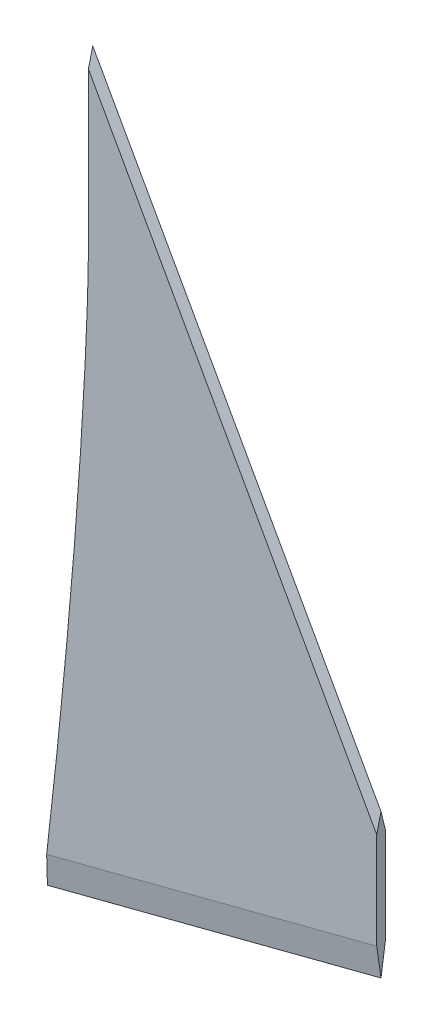
ISO-10303-21;
HEADER;
FILE_DESCRIPTION(('STEP AP214'),'2;1');
FILE_NAME('part.step','',(''),(''),'','','');
FILE_SCHEMA(('AUTOMOTIVE_DESIGN { 1 0 10303 214 1 1 1 1 }'));
ENDSEC;
DATA;
#1=APPLICATION_CONTEXT('core data for automotive mechanical design processes');
#2=APPLICATION_PROTOCOL_DEFINITION('international standard','automotive_design',2000,#1);
#3=PRODUCT_CONTEXT('',#1,'mechanical');
#4=PRODUCT('Part','Part','',(#3));
#5=PRODUCT_RELATED_PRODUCT_CATEGORY('part','',(#4));
#6=PRODUCT_DEFINITION_FORMATION('','',#4);
#7=PRODUCT_DEFINITION_CONTEXT('part definition',#1,'design');
#8=PRODUCT_DEFINITION('design','',#6,#7);
#9=PRODUCT_DEFINITION_SHAPE('','',#8);
#10=(LENGTH_UNIT() NAMED_UNIT(*) SI_UNIT(.MILLI.,.METRE.));
#11=(NAMED_UNIT(*) PLANE_ANGLE_UNIT() SI_UNIT($,.RADIAN.));
#12=(NAMED_UNIT(*) SI_UNIT($,.STERADIAN.) SOLID_ANGLE_UNIT());
#13=UNCERTAINTY_MEASURE_WITH_UNIT(LENGTH_MEASURE(1.E-05),#10,'distance_accuracy_value','');
#14=(GEOMETRIC_REPRESENTATION_CONTEXT(3) GLOBAL_UNCERTAINTY_ASSIGNED_CONTEXT((#13)) GLOBAL_UNIT_ASSIGNED_CONTEXT((#10,
#11,#12)) REPRESENTATION_CONTEXT('',''));
#15=CARTESIAN_POINT('',(0.,0.,0.));
#16=DIRECTION('',(0.,0.,1.));
#17=DIRECTION('',(1.,0.,0.));
#18=AXIS2_PLACEMENT_3D('',#15,#16,#17);
#19=CARTESIAN_POINT('',(176.000000000028,0.,3.));
#20=DIRECTION('',(1.,0.,0.));
#21=DIRECTION('',(0.,0.,-1.));
#22=AXIS2_PLACEMENT_3D('',#19,#20,#21);
#23=PLANE('',#22);
#24=DIRECTION('',(0.,0.9896222064777,0.143693731408888));
#25=VECTOR('',#24,1.);
#26=CARTESIAN_POINT('',(176.000000000028,7.04754906013995,-45.5366409708541));
#27=LINE('',#26,#25);
#28=CARTESIAN_POINT('',(176.000000000028,341.320570309148,3.));
#29=VERTEX_POINT('',#28);
#30=CARTESIAN_POINT('',(176.000000000028,330.990034,1.5));
#31=VERTEX_POINT('',#30);
#32=EDGE_CURVE('E202',#29,#31,#27,.F.);
#33=ORIENTED_EDGE('',*,*,#32,.T.);
#34=DIRECTION('',(0.,0.989622206477699,-0.143693731408889));
#35=VECTOR('',#34,1.);
#36=CARTESIAN_POINT('',(176.000000000028,6.62094153753839,48.598584636193));
#37=LINE('',#36,#35);
#38=CARTESIAN_POINT('',(176.000000000028,341.320570309148,0.));
#39=VERTEX_POINT('',#38);
#40=EDGE_CURVE('E11',#31,#39,#37,.T.);
#41=ORIENTED_EDGE('',*,*,#40,.T.);
#42=DIRECTION('',(0.,-1.,0.));
#43=VECTOR('',#42,1.);
#44=CARTESIAN_POINT('',(176.000000000028,0.,0.));
#45=LINE('',#44,#43);
#46=CARTESIAN_POINT('',(176.000000000028,374.812655915408,0.));
#47=VERTEX_POINT('',#46);
#48=EDGE_CURVE('E127',#47,#39,#45,.T.);
#49=ORIENTED_EDGE('',*,*,#48,.F.);
#50=DIRECTION('',(0.,0.97176165426244,0.23596458909151));
#51=VECTOR('',#50,1.);
#52=CARTESIAN_POINT('',(176.000000000028,21.5572055726398,-85.778006179647));
#53=LINE('',#52,#51);
#54=CARTESIAN_POINT('',(176.000000000028,380.990034,1.50000000000003));
#55=VERTEX_POINT('',#54);
#56=EDGE_CURVE('E219',#47,#55,#53,.T.);
#57=ORIENTED_EDGE('',*,*,#56,.T.);
#58=DIRECTION('',(0.,0.971761654262441,-0.235964589091507));
#59=VECTOR('',#58,1.);
#60=CARTESIAN_POINT('',(176.000000000028,20.8693015543104,88.9450440415612));
#61=LINE('',#60,#59);
#62=CARTESIAN_POINT('',(176.000000000028,374.812655915408,3.));
#63=VERTEX_POINT('',#62);
#64=EDGE_CURVE('E227',#55,#63,#61,.F.);
#65=ORIENTED_EDGE('',*,*,#64,.T.);
#66=DIRECTION('',(0.,-1.,0.));
#67=VECTOR('',#66,1.);
#68=CARTESIAN_POINT('',(176.000000000028,0.,3.));
#69=LINE('',#68,#67);
#70=EDGE_CURVE('E130',#63,#29,#69,.T.);
#71=ORIENTED_EDGE('',*,*,#70,.T.);
#72=EDGE_LOOP('',(#33,#41,#49,#57,#65,#71));
#73=FACE_BOUND('',#72,.T.);
#74=ADVANCED_FACE('F45',(#73),#23,.T.);
#75=CARTESIAN_POINT('',(0.,0.,3.));
#76=DIRECTION('',(0.,0.,1.));
#77=DIRECTION('',(1.,0.,0.));
#78=AXIS2_PLACEMENT_3D('',#75,#76,#77);
#79=PLANE('',#78);
#80=CARTESIAN_POINT('',(60.2536508811545,300.990034,3.));
#81=CARTESIAN_POINT('',(60.6785853909016,304.546365833908,3.));
#82=CARTESIAN_POINT('',(61.097200199767,308.103453170029,3.));
#83=CARTESIAN_POINT('',(61.9216842096842,315.219092907531,3.));
#84=CARTESIAN_POINT('',(62.3275534520864,318.777645304121,3.));
#85=CARTESIAN_POINT('',(63.126441409352,325.896179180605,3.));
#86=CARTESIAN_POINT('',(63.5194601715832,329.456160655181,3.));
#87=CARTESIAN_POINT('',(64.2924775573231,336.577523682173,3.));
#88=CARTESIAN_POINT('',(64.6724762295165,340.138905229302,3.));
#89=CARTESIAN_POINT('',(65.4192321078945,347.263045156729,3.));
#90=CARTESIAN_POINT('',(65.7859893561779,350.825803532611,3.));
#91=CARTESIAN_POINT('',(66.5057771569488,357.950626326355,3.));
#92=CARTESIAN_POINT('',(66.8588155224284,361.512689954679,3.));
#93=CARTESIAN_POINT('',(67.5510406758639,368.638167495362,3.));
#94=CARTESIAN_POINT('',(67.8902274478424,372.201581409272,3.));
#95=CARTESIAN_POINT('',(68.554320678043,379.329756261965,3.));
#96=CARTESIAN_POINT('',(68.8792270730575,382.894517206639,3.));
#97=CARTESIAN_POINT('',(69.5142377857487,390.02539101263,3.));
#98=CARTESIAN_POINT('',(69.8243419665478,393.59150388614,3.));
#99=CARTESIAN_POINT('',(70.4291109094859,400.725098551218,3.));
#100=CARTESIAN_POINT('',(70.7237754219409,404.292580363983,3.));
#101=CARTESIAN_POINT('',(71.215481700211,410.415426380997,3.));
#102=CARTESIAN_POINT('',(71.4164804986665,412.970473302637,3.));
#103=CARTESIAN_POINT('',(71.8098063595635,418.08123972475,3.));
#104=CARTESIAN_POINT('',(72.0021334071619,420.636959226367,3.));
#105=CARTESIAN_POINT('',(72.3777020518628,425.749044715823,3.));
#106=CARTESIAN_POINT('',(72.5609437246708,428.305410698097,3.));
#107=CARTESIAN_POINT('',(72.9178555944184,433.418768760179,3.));
#108=CARTESIAN_POINT('',(73.0915259503482,435.975760828877,3.));
#109=CARTESIAN_POINT('',(73.4287071042614,441.090357672655,3.));
#110=CARTESIAN_POINT('',(73.5922181310891,443.647962432631,3.));
#111=CARTESIAN_POINT('',(73.9083619767468,448.763780813504,3.));
#112=CARTESIAN_POINT('',(74.0609950693902,451.321994417449,3.));
#113=CARTESIAN_POINT('',(74.3545568865105,456.440425452943,3.));
#114=CARTESIAN_POINT('',(74.4954794989105,459.000643235594,3.));
#115=CARTESIAN_POINT('',(74.764355099159,464.121760164454,3.));
#116=CARTESIAN_POINT('',(74.8923081060695,466.682659309657,3.));
#117=CARTESIAN_POINT('',(75.0733052048482,470.524535886168,3.));
#118=CARTESIAN_POINT('',(75.1318158217772,471.805257098221,3.));
#119=CARTESIAN_POINT('',(75.2449049969214,474.366872517927,3.));
#120=CARTESIAN_POINT('',(75.2994835587771,475.647766725418,3.));
#121=CARTESIAN_POINT('',(75.4043978519613,478.209771726704,3.));
#122=CARTESIAN_POINT('',(75.4547334427399,479.490882526265,3.));
#123=CARTESIAN_POINT('',(75.5507300765249,482.053283654922,3.));
#124=CARTESIAN_POINT('',(75.5963911052226,483.334573984555,3.));
#125=CARTESIAN_POINT('',(75.6824404293228,485.89744400944,3.));
#126=CARTESIAN_POINT('',(75.7228282690779,487.179023720124,3.));
#127=CARTESIAN_POINT('',(75.7788864303194,489.101519519176,3.));
#128=CARTESIAN_POINT('',(75.7968184914386,489.742370054917,3.));
#129=CARTESIAN_POINT('',(75.8309962747408,491.024117345248,3.));
#130=CARTESIAN_POINT('',(75.8472419943407,491.665014099908,3.));
#131=CARTESIAN_POINT('',(75.8778032191007,492.947006803599,3.));
#132=CARTESIAN_POINT('',(75.8921182632536,493.588102763698,3.));
#133=CARTESIAN_POINT('',(75.912016986142,494.549777970235,3.));
#134=CARTESIAN_POINT('',(75.9183875775191,494.870341065097,3.));
#135=CARTESIAN_POINT('',(75.930548710234,495.511478179019,3.));
#136=CARTESIAN_POINT('',(75.9363392518424,495.832052198074,3.));
#137=CARTESIAN_POINT('',(75.947232360656,496.473220100962,3.));
#138=CARTESIAN_POINT('',(75.9523349105499,496.793813985092,3.));
#139=CARTESIAN_POINT('',(75.9616711228757,497.435014752307,3.));
#140=CARTESIAN_POINT('',(75.9659047847442,497.755621635401,3.));
#141=CARTESIAN_POINT('',(75.9715882136242,498.236541851229,3.));
#142=CARTESIAN_POINT('',(75.9733715222307,498.396851303639,3.));
#143=CARTESIAN_POINT('',(75.9767560957958,498.717471759484,3.));
#144=CARTESIAN_POINT('',(75.9783573610857,498.877782762915,3.));
#145=CARTESIAN_POINT('',(75.9812806961037,499.198408681418,3.));
#146=CARTESIAN_POINT('',(75.9826027642224,499.358723596507,3.));
#147=CARTESIAN_POINT('',(75.9845382266817,499.679358185167,3.));
#148=CARTESIAN_POINT('',(75.9851516174988,499.839677858758,3.));
#149=CARTESIAN_POINT('',(75.9851959266031,499.999999999996,3.));
#150=B_SPLINE_CURVE_WITH_KNOTS('',3,(#80,#81,#82,#83,#84,#85,#86,#87,#88,#89,#90,#91,#92,#93,
#94,#95,#96,#97,#98,#99,#100,#101,#102,#103,#104,#105,#106,#107,#108,#109,#110,#111,#112,#113,
#114,#115,#116,#117,#118,#119,#120,#121,#122,#123,#124,#125,#126,#127,#128,#129,#130,#131,#132,
#133,#134,#135,#136,#137,#138,#139,#140,#141,#142,#143,#144,#145,#146,#147,#148,#149),
.UNSPECIFIED.,.F.,.F.,(4,2,2,2,2,2,2,2,2,2,2,2,2,2,2,2,2,2,2,2,2,2,2,2,2,2,2,2,2,2,2,2,2,2,4),
(0.,10.7448815413634,21.4897282195317,32.2345352869447,42.9793021730775,53.7240348951753,
64.4625559585472,75.2010894082208,85.9396703838167,96.6783506409877,107.417204506211,
115.106013493709,122.794835641374,130.483593709711,138.172224020668,145.860681078241,
153.54894453785,161.241195870735,168.93343589784,172.779602210909,176.625764962905,
180.472055070349,184.31835695087,188.164990964161,190.088293349905,192.011598681759,
193.935362450863,194.89724122467,195.859119549879,196.821022073666,197.78292522119,
198.263883186809,198.744840277482,199.225800140543,199.706762394857),.UNSPECIFIED.);
#151=CARTESIAN_POINT('',(61.5070524907201,311.640649331816,3.));
#152=VERTEX_POINT('',#151);
#153=CARTESIAN_POINT('',(75.9851959266031,499.999999999996,3.));
#154=VERTEX_POINT('',#153);
#155=EDGE_CURVE('E106',#152,#154,#150,.T.);
#156=ORIENTED_EDGE('',*,*,#155,.F.);
#157=DIRECTION('',(0.968003954561823,0.250934939680932,0.));
#158=VECTOR('',#157,1.);
#159=CARTESIAN_POINT('',(-71.8263906768795,277.076720784791,3.));
#160=LINE('',#159,#158);
#161=EDGE_CURVE('E173',#152,#29,#160,.T.);
#162=ORIENTED_EDGE('',*,*,#161,.T.);
#163=ORIENTED_EDGE('',*,*,#70,.F.);
#164=DIRECTION('',(-0.485642931178632,0.874157276121538,0.));
#165=VECTOR('',#164,1.);
#166=CARTESIAN_POINT('',(293.609146379204,163.116192432891,3.));
#167=LINE('',#166,#165);
#168=CARTESIAN_POINT('',(75.9851959266031,554.839303247573,3.));
#169=VERTEX_POINT('',#168);
#170=EDGE_CURVE('E126',#63,#169,#167,.T.);
#171=ORIENTED_EDGE('',*,*,#170,.T.);
#172=DIRECTION('',(0.,-1.,0.));
#173=VECTOR('',#172,1.);
#174=CARTESIAN_POINT('',(75.9851959266031,0.,3.));
#175=LINE('',#174,#173);
#176=EDGE_CURVE('E114',#154,#169,#175,.F.);
#177=ORIENTED_EDGE('',*,*,#176,.F.);
#178=EDGE_LOOP('',(#156,#162,#163,#171,#177));
#179=FACE_BOUND('',#178,.T.);
#180=ADVANCED_FACE('F123',(#179),#79,.T.);
#181=CARTESIAN_POINT('',(0.,0.,0.));
#182=DIRECTION('',(0.,0.,1.));
#183=DIRECTION('',(1.,0.,0.));
#184=AXIS2_PLACEMENT_3D('',#181,#182,#183);
#185=PLANE('',#184);
#186=ORIENTED_EDGE('',*,*,#48,.T.);
#187=DIRECTION('',(-0.968003954561823,-0.250934939680932,0.));
#188=VECTOR('',#187,1.);
#189=CARTESIAN_POINT('',(57.7629696601844,310.670073545619,0.));
#190=LINE('',#189,#188);
#191=CARTESIAN_POINT('',(61.50705249072,311.640649331815,0.));
#192=VERTEX_POINT('',#191);
#193=EDGE_CURVE('E205',#39,#192,#190,.T.);
#194=ORIENTED_EDGE('',*,*,#193,.T.);
#195=CARTESIAN_POINT('',(60.2536508811545,300.990034,0.));
#196=CARTESIAN_POINT('',(60.6785853909016,304.546365833908,0.));
#197=CARTESIAN_POINT('',(61.097200199767,308.103453170029,0.));
#198=CARTESIAN_POINT('',(61.9216842096842,315.219092907531,0.));
#199=CARTESIAN_POINT('',(62.3275534520864,318.777645304121,0.));
#200=CARTESIAN_POINT('',(63.126441409352,325.896179180605,0.));
#201=CARTESIAN_POINT('',(63.5194601715832,329.456160655181,0.));
#202=CARTESIAN_POINT('',(64.2924775573231,336.577523682173,0.));
#203=CARTESIAN_POINT('',(64.6724762295165,340.138905229302,0.));
#204=CARTESIAN_POINT('',(65.4192321078945,347.263045156729,0.));
#205=CARTESIAN_POINT('',(65.7859893561779,350.825803532611,0.));
#206=CARTESIAN_POINT('',(66.5057771569488,357.950626326355,0.));
#207=CARTESIAN_POINT('',(66.8588155224284,361.512689954679,0.));
#208=CARTESIAN_POINT('',(67.5510406758639,368.638167495362,0.));
#209=CARTESIAN_POINT('',(67.8902274478424,372.201581409272,0.));
#210=CARTESIAN_POINT('',(68.554320678043,379.329756261965,0.));
#211=CARTESIAN_POINT('',(68.8792270730575,382.894517206639,0.));
#212=CARTESIAN_POINT('',(69.5142377857487,390.02539101263,0.));
#213=CARTESIAN_POINT('',(69.8243419665478,393.59150388614,0.));
#214=CARTESIAN_POINT('',(70.4291109094859,400.725098551218,0.));
#215=CARTESIAN_POINT('',(70.7237754219409,404.292580363983,0.));
#216=CARTESIAN_POINT('',(71.215481700211,410.415426380997,0.));
#217=CARTESIAN_POINT('',(71.4164804986665,412.970473302637,0.));
#218=CARTESIAN_POINT('',(71.8098063595635,418.08123972475,0.));
#219=CARTESIAN_POINT('',(72.0021334071619,420.636959226367,0.));
#220=CARTESIAN_POINT('',(72.3777020518628,425.749044715823,0.));
#221=CARTESIAN_POINT('',(72.5609437246708,428.305410698097,0.));
#222=CARTESIAN_POINT('',(72.9178555944184,433.418768760179,0.));
#223=CARTESIAN_POINT('',(73.0915259503482,435.975760828877,0.));
#224=CARTESIAN_POINT('',(73.4287071042614,441.090357672655,0.));
#225=CARTESIAN_POINT('',(73.5922181310891,443.647962432631,0.));
#226=CARTESIAN_POINT('',(73.9083619767468,448.763780813504,0.));
#227=CARTESIAN_POINT('',(74.0609950693902,451.321994417449,0.));
#228=CARTESIAN_POINT('',(74.3545568865105,456.440425452943,0.));
#229=CARTESIAN_POINT('',(74.4954794989105,459.000643235594,0.));
#230=CARTESIAN_POINT('',(74.764355099159,464.121760164454,0.));
#231=CARTESIAN_POINT('',(74.8923081060695,466.682659309657,0.));
#232=CARTESIAN_POINT('',(75.0733052048482,470.524535886168,0.));
#233=CARTESIAN_POINT('',(75.1318158217772,471.805257098221,0.));
#234=CARTESIAN_POINT('',(75.2449049969214,474.366872517927,0.));
#235=CARTESIAN_POINT('',(75.2994835587771,475.647766725418,0.));
#236=CARTESIAN_POINT('',(75.4043978519613,478.209771726704,0.));
#237=CARTESIAN_POINT('',(75.4547334427399,479.490882526265,0.));
#238=CARTESIAN_POINT('',(75.5507300765249,482.053283654922,0.));
#239=CARTESIAN_POINT('',(75.5963911052226,483.334573984555,0.));
#240=CARTESIAN_POINT('',(75.6824404293228,485.89744400944,0.));
#241=CARTESIAN_POINT('',(75.7228282690779,487.179023720124,0.));
#242=CARTESIAN_POINT('',(75.7788864303194,489.101519519176,0.));
#243=CARTESIAN_POINT('',(75.7968184914386,489.742370054917,0.));
#244=CARTESIAN_POINT('',(75.8309962747408,491.024117345248,0.));
#245=CARTESIAN_POINT('',(75.8472419943407,491.665014099908,0.));
#246=CARTESIAN_POINT('',(75.8778032191007,492.947006803599,0.));
#247=CARTESIAN_POINT('',(75.8921182632536,493.588102763698,0.));
#248=CARTESIAN_POINT('',(75.912016986142,494.549777970235,0.));
#249=CARTESIAN_POINT('',(75.9183875775191,494.870341065097,0.));
#250=CARTESIAN_POINT('',(75.930548710234,495.511478179019,0.));
#251=CARTESIAN_POINT('',(75.9363392518424,495.832052198074,0.));
#252=CARTESIAN_POINT('',(75.947232360656,496.473220100962,0.));
#253=CARTESIAN_POINT('',(75.9523349105499,496.793813985092,0.));
#254=CARTESIAN_POINT('',(75.9616711228757,497.435014752307,0.));
#255=CARTESIAN_POINT('',(75.9659047847442,497.755621635401,0.));
#256=CARTESIAN_POINT('',(75.9715882136242,498.236541851229,0.));
#257=CARTESIAN_POINT('',(75.9733715222307,498.396851303639,0.));
#258=CARTESIAN_POINT('',(75.9767560957958,498.717471759484,0.));
#259=CARTESIAN_POINT('',(75.9783573610857,498.877782762915,0.));
#260=CARTESIAN_POINT('',(75.9812806961037,499.198408681418,0.));
#261=CARTESIAN_POINT('',(75.9826027642224,499.358723596507,0.));
#262=CARTESIAN_POINT('',(75.9845382266817,499.679358185167,0.));
#263=CARTESIAN_POINT('',(75.9851516174988,499.839677858758,0.));
#264=CARTESIAN_POINT('',(75.9851959266031,499.999999999996,0.));
#265=B_SPLINE_CURVE_WITH_KNOTS('',3,(#195,#196,#197,#198,#199,#200,#201,#202,#203,#204,#205,
#206,#207,#208,#209,#210,#211,#212,#213,#214,#215,#216,#217,#218,#219,#220,#221,#222,#223,#224,
#225,#226,#227,#228,#229,#230,#231,#232,#233,#234,#235,#236,#237,#238,#239,#240,#241,#242,#243,
#244,#245,#246,#247,#248,#249,#250,#251,#252,#253,#254,#255,#256,#257,#258,#259,#260,#261,#262,
#263,#264),.UNSPECIFIED.,.F.,.F.,(4,2,2,2,2,2,2,2,2,2,2,2,2,2,2,2,2,2,2,2,2,2,2,2,2,2,2,2,2,2,2,
2,2,2,4),(0.,10.7448815413634,21.4897282195317,32.2345352869447,42.9793021730775,
53.7240348951753,64.4625559585472,75.2010894082208,85.9396703838167,96.6783506409877,
107.417204506211,115.106013493709,122.794835641374,130.483593709711,138.172224020668,
145.860681078241,153.54894453785,161.241195870735,168.93343589784,172.779602210909,
176.625764962905,180.472055070349,184.31835695087,188.164990964161,190.088293349905,
192.011598681759,193.935362450863,194.89724122467,195.859119549879,196.821022073666,
197.78292522119,198.263883186809,198.744840277482,199.225800140543,199.706762394857),.UNSPECIFIED.);
#266=CARTESIAN_POINT('',(75.9851959266031,499.999999999996,0.));
#267=VERTEX_POINT('',#266);
#268=EDGE_CURVE('E140',#192,#267,#265,.T.);
#269=ORIENTED_EDGE('',*,*,#268,.T.);
#270=DIRECTION('',(0.,-1.,0.));
#271=VECTOR('',#270,1.);
#272=CARTESIAN_POINT('',(75.9851959266031,0.,0.));
#273=LINE('',#272,#271);
#274=CARTESIAN_POINT('',(75.9851959266031,554.839303247573,0.));
#275=VERTEX_POINT('',#274);
#276=EDGE_CURVE('E121',#267,#275,#273,.F.);
#277=ORIENTED_EDGE('',*,*,#276,.T.);
#278=DIRECTION('',(0.485642931178632,-0.874157276121538,0.));
#279=VECTOR('',#278,1.);
#280=CARTESIAN_POINT('',(173.377528171663,379.533105206464,0.));
#281=LINE('',#280,#279);
#282=EDGE_CURVE('E215',#275,#47,#281,.T.);
#283=ORIENTED_EDGE('',*,*,#282,.T.);
#284=EDGE_LOOP('',(#186,#194,#269,#277,#283));
#285=FACE_BOUND('',#284,.T.);
#286=ADVANCED_FACE('F149',(#285),#185,.F.);
#287=CARTESIAN_POINT('',(0.,0.,1.5));
#288=DIRECTION('',(0.,-1.,0.));
#289=DIRECTION('',(0.,0.,-1.));
#290=AXIS2_PLACEMENT_3D('',#287,#288,#289);
#291=CYLINDRICAL_SURFACE('',#290,76.000000000028);
#292=CARTESIAN_POINT('',(0.,697.790034000051,1.5));
#293=DIRECTION('',(-0.390935018486766,-0.217186121381537,-0.894427190999914));
#294=DIRECTION('',(0.0869818999833608,-0.976130210924365,0.199007438041999));
#295=AXIS2_PLACEMENT_3D('',#292,#293,#294);
#296=ELLIPSE('',#295,349.930278770055,76.000000000028);
#297=CARTESIAN_POINT('',(76.000000000028,560.990034,1.5));
#298=VERTEX_POINT('',#297);
#299=EDGE_CURVE('E220',#169,#298,#296,.F.);
#300=ORIENTED_EDGE('',*,*,#299,.T.);
#301=CARTESIAN_POINT('',(0.,697.790034000051,1.5));
#302=DIRECTION('',(0.39093501848677,0.217186121381539,-0.894427190999911));
#303=DIRECTION('',(0.0869818999833628,-0.976130210924364,-0.199007438042001));
#304=AXIS2_PLACEMENT_3D('',#301,#302,#303);
#305=ELLIPSE('',#304,349.930278770051,76.000000000028);
#306=EDGE_CURVE('E206',#298,#275,#305,.T.);
#307=ORIENTED_EDGE('',*,*,#306,.T.);
#308=ORIENTED_EDGE('',*,*,#276,.F.);
#309=CARTESIAN_POINT('',(0.,499.999999999996,1.5));
#310=DIRECTION('',(0.,-1.,0.));
#311=DIRECTION('',(0.,0.,-1.));
#312=AXIS2_PLACEMENT_3D('',#309,#310,#311);
#313=CIRCLE('',#312,76.000000000028);
#314=EDGE_CURVE('E110',#267,#154,#313,.T.);
#315=ORIENTED_EDGE('',*,*,#314,.T.);
#316=ORIENTED_EDGE('',*,*,#176,.T.);
#317=EDGE_LOOP('',(#300,#307,#308,#315,#316));
#318=FACE_BOUND('',#317,.T.);
#319=ADVANCED_FACE('F118',(#318),#291,.F.);
#320=CARTESIAN_POINT('',(0.,0.,1.5));
#321=CARTESIAN_POINT('',(0.0137838164741063,0.00348815708150223,1.5));
#322=CARTESIAN_POINT('',(0.0403360303835583,0.0131905095443447,1.5));
#323=CARTESIAN_POINT('',(0.0896193783404145,0.0420634552482114,1.5));
#324=CARTESIAN_POINT('',(0.174781235928564,0.103253354051157,1.5));
#325=CARTESIAN_POINT('',(0.279068590720675,0.195655925163728,1.5));
#326=CARTESIAN_POINT('',(0.394476748091305,0.31289335945204,1.5));
#327=CARTESIAN_POINT('',(0.511330855445285,0.444471000774003,1.5));
#328=CARTESIAN_POINT('',(0.661995475048687,0.626416713035147,1.5));
#329=CARTESIAN_POINT('',(0.874340043040871,0.905417523507298,1.5));
#330=CARTESIAN_POINT('',(1.21028834407048,1.39310301039426,1.5));
#331=CARTESIAN_POINT('',(1.74793599332243,2.2714971789691,1.5));
#332=CARTESIAN_POINT('',(2.58108843018797,3.81588257952715,1.5));
#333=CARTESIAN_POINT('',(3.90773413631351,6.62984422899713,1.5));
#334=CARTESIAN_POINT('',(5.99062653456973,11.7321798562475,1.5));
#335=CARTESIAN_POINT('',(8.97478283846041,20.2155176698397,1.5));
#336=CARTESIAN_POINT('',(12.4921164932717,31.7244890273757,1.5));
#337=CARTESIAN_POINT('',(16.2811720859847,45.6067992876057,1.5));
#338=CARTESIAN_POINT('',(21.0208608111301,64.6513713207126,1.5));
#339=CARTESIAN_POINT('',(26.2066316623173,87.6583688981072,1.5));
#340=CARTESIAN_POINT('',(31.7463204916184,114.722363421532,1.5));
#341=CARTESIAN_POINT('',(37.5378964984615,145.854010301489,1.5));
#342=CARTESIAN_POINT('',(42.8718072058584,177.066921725599,1.5));
#343=CARTESIAN_POINT('',(47.8072342797269,208.345145014485,1.5));
#344=CARTESIAN_POINT('',(52.3811910671952,239.678124677571,1.5));
#345=CARTESIAN_POINT('',(56.6151535218074,271.058803784994,1.5));
#346=CARTESIAN_POINT('',(60.5196800248852,302.482154914173,1.5));
#347=CARTESIAN_POINT('',(63.6484182577144,330.011833268375,1.5));
#348=CARTESIAN_POINT('',(66.118942949873,353.631593101496,1.5));
#349=CARTESIAN_POINT('',(68.030132580503,373.32946634297,1.5));
#350=CARTESIAN_POINT('',(69.4667844433621,389.096438559729,1.5));
#351=CARTESIAN_POINT('',(70.8061290179944,404.871994610147,1.5));
#352=CARTESIAN_POINT('',(71.8869969930608,418.683052252657,1.5));
#353=CARTESIAN_POINT('',(72.7426627687839,430.526418849087,1.5));
#354=CARTESIAN_POINT('',(73.4044359722321,440.399441684296,1.5));
#355=CARTESIAN_POINT('',(73.9010713280141,448.299980016572,1.5));
#356=CARTESIAN_POINT('',(74.3047755760368,455.214817723783,1.5));
#357=CARTESIAN_POINT('',(74.6267795298896,461.143160455539,1.5));
#358=CARTESIAN_POINT('',(74.8778015175077,466.084350078188,1.5));
#359=CARTESIAN_POINT('',(75.067577987082,470.037846817324,1.5));
#360=CARTESIAN_POINT('',(75.3363036357765,476.005510657437,1.5));
#361=CARTESIAN_POINT('',(75.563352259332,481.736537174145,1.5));
#362=CARTESIAN_POINT('',(75.7480857215088,487.230769758859,1.5));
#363=CARTESIAN_POINT('',(75.8846626039835,492.48806152451,1.5));
#364=CARTESIAN_POINT('',(75.9403485229266,495.116996281493,1.5));
#365=CARTESIAN_POINT('',(75.9780437969043,497.37057728061,1.5));
#366=CARTESIAN_POINT('',(75.9935941175811,498.873076170457,1.5));
#367=CARTESIAN_POINT('',(76.000000000028,499.624354133599,1.5));
#368=CARTESIAN_POINT('',(76.000000000028,499.999999999996,1.5));
#369=B_SPLINE_CURVE_WITH_KNOTS('',4,(#320,#321,#322,#323,#324,#325,#326,#327,#328,#329,#330,
#331,#332,#333,#334,#335,#336,#337,#338,#339,#340,#341,#342,#343,#344,#345,#346,#347,#348,#349,
#350,#351,#352,#353,#354,#355,#356,#357,#358,#359,#360,#361,#362,#363,#364,#365,#366,#367,#368),
.UNSPECIFIED.,.F.,.F.,(5,1,1,1,1,1,1,1,1,1,1,1,1,1,1,1,1,1,1,1,1,1,1,1,1,1,1,1,1,1,1,1,1,1,1,1,
1,1,1,1,1,1,1,1,1,5),(0.,0.000111673062630076,0.000223346125260152,0.000446692250520304,
0.000826683235703061,0.00120667422088582,0.00151954992421425,0.00183242562754267,
0.0026877896203818,0.00396811963384161,0.00618344769063095,0.00994281232869323,
0.0165070850460175,0.0284683202746382,0.0495866333595542,0.0807722271290261,0.111303183902214,
0.141834140675402,0.204203934807264,0.266574069316943,0.328944260118331,0.391314419863145,
0.453684462992774,0.51605456776173,0.578424700722885,0.640794794781792,0.703164954855881,
0.734350023220203,0.765535091584526,0.796720055272376,0.827905018960225,0.859090157331689,
0.874682726517421,0.890275295703153,0.90586778674361,0.921460277784067,0.929256523304296,
0.937052768824524,0.944849014344753,0.952645259864981,0.976322629932491,0.982241972449368,
0.988161314966245,0.994080657483123,0.997040328741561,1.),.UNSPECIFIED.);
#370=CARTESIAN_POINT('',(0.,0.,1.5));
#371=DIRECTION('',(0.,-1.,0.));
#372=AXIS1_PLACEMENT('',#370,#371);
#373=SURFACE_OF_REVOLUTION('',#369,#372);
#374=ORIENTED_EDGE('',*,*,#268,.F.);
#375=CARTESIAN_POINT('',(61.50705249072,311.640649331816,0.));
#376=CARTESIAN_POINT('',(61.3074108782038,309.864880332591,0.25032815364646));
#377=CARTESIAN_POINT('',(61.1046956191352,308.089444555328,0.500492230469703));
#378=CARTESIAN_POINT('',(60.6931178078931,304.539239444722,1.00049223046971));
#379=CARTESIAN_POINT('',(60.4842552557197,302.764470111381,1.25032815364648));
#380=CARTESIAN_POINT('',(60.2723190569938,300.990034,1.50000000000001));
#381=B_SPLINE_CURVE_WITH_KNOTS('',3,(#375,#376,#377,#378,#379,#380),.UNSPECIFIED.,.F.,.F.,(4,2,
4),(0.,5.41319034091884,10.8263806818377),.UNSPECIFIED.);
#382=CARTESIAN_POINT('',(60.2723190569938,300.990034,1.5));
#383=VERTEX_POINT('',#382);
#384=EDGE_CURVE('E55',#192,#383,#381,.T.);
#385=ORIENTED_EDGE('',*,*,#384,.T.);
#386=CARTESIAN_POINT('',(60.2723190569938,300.990034,1.50000000000001));
#387=CARTESIAN_POINT('',(60.4842552557196,302.764470111381,1.74967184635353));
#388=CARTESIAN_POINT('',(60.6931178078931,304.539239444722,1.99950776953029));
#389=CARTESIAN_POINT('',(61.1046956191352,308.089444555328,2.49950776953028));
#390=CARTESIAN_POINT('',(61.3074108782039,309.864880332591,2.74967184635351));
#391=CARTESIAN_POINT('',(61.5070524907201,311.640649331816,2.99999999999997));
#392=B_SPLINE_CURVE_WITH_KNOTS('',3,(#386,#387,#388,#389,#390,#391),.UNSPECIFIED.,.F.,.F.,(4,2,
4),(0.,5.41319034091889,10.8263806818377),.UNSPECIFIED.);
#393=EDGE_CURVE('E62',#383,#152,#392,.T.);
#394=ORIENTED_EDGE('',*,*,#393,.T.);
#395=ORIENTED_EDGE('',*,*,#155,.T.);
#396=ORIENTED_EDGE('',*,*,#314,.F.);
#397=EDGE_LOOP('',(#374,#385,#394,#395,#396));
#398=FACE_BOUND('',#397,.T.);
#399=ADVANCED_FACE('F109',(#398),#373,.T.);
#400=CARTESIAN_POINT('',(296.231618207569,164.573121226427,1.50000000000003));
#401=DIRECTION('',(-0.390935018486766,-0.217186121381537,-0.894427190999914));
#402=DIRECTION('',(0.485642931178632,-0.874157276121538,0.));
#403=AXIS2_PLACEMENT_3D('',#400,#401,#402);
#404=PLANE('',#403);
#405=ORIENTED_EDGE('',*,*,#299,.F.);
#406=ORIENTED_EDGE('',*,*,#170,.F.);
#407=ORIENTED_EDGE('',*,*,#64,.F.);
#408=DIRECTION('',(0.485642931178632,-0.874157276121538,0.));
#409=VECTOR('',#408,1.);
#410=CARTESIAN_POINT('',(296.231618207569,164.573121226427,1.50000000000003));
#411=LINE('',#410,#409);
#412=EDGE_CURVE('E216',#298,#55,#411,.T.);
#413=ORIENTED_EDGE('',*,*,#412,.F.);
#414=EDGE_LOOP('',(#405,#406,#407,#413));
#415=FACE_BOUND('',#414,.T.);
#416=ADVANCED_FACE('F156',(#415),#404,.F.);
#417=CARTESIAN_POINT('',(293.609146379204,163.116192432891,0.));
#418=DIRECTION('',(0.39093501848677,0.217186121381539,-0.894427190999911));
#419=DIRECTION('',(-0.485642931178632,0.874157276121538,0.));
#420=AXIS2_PLACEMENT_3D('',#417,#418,#419);
#421=PLANE('',#420);
#422=ORIENTED_EDGE('',*,*,#306,.F.);
#423=ORIENTED_EDGE('',*,*,#412,.T.);
#424=ORIENTED_EDGE('',*,*,#56,.F.);
#425=ORIENTED_EDGE('',*,*,#282,.F.);
#426=EDGE_LOOP('',(#422,#423,#424,#425));
#427=FACE_BOUND('',#426,.T.);
#428=ADVANCED_FACE('F185',(#427),#421,.T.);
#429=CARTESIAN_POINT('',(-69.3170412800702,267.396681239172,1.5));
#430=DIRECTION('',(-0.0372238026082921,0.143594145057965,-0.988936352868298));
#431=DIRECTION('',(-0.968003954561823,-0.250934939680932,0.));
#432=AXIS2_PLACEMENT_3D('',#429,#430,#431);
#433=PLANE('',#432);
#434=ORIENTED_EDGE('',*,*,#32,.F.);
#435=ORIENTED_EDGE('',*,*,#161,.F.);
#436=ORIENTED_EDGE('',*,*,#393,.F.);
#437=DIRECTION('',(-0.968003954561823,-0.250934939680932,0.));
#438=VECTOR('',#437,1.);
#439=CARTESIAN_POINT('',(-69.3170412800702,267.396681239172,1.5));
#440=LINE('',#439,#438);
#441=EDGE_CURVE('E174',#31,#383,#440,.T.);
#442=ORIENTED_EDGE('',*,*,#441,.F.);
#443=EDGE_LOOP('',(#434,#435,#436,#442));
#444=FACE_BOUND('',#443,.T.);
#445=ADVANCED_FACE('F178',(#444),#433,.F.);
#446=CARTESIAN_POINT('',(-71.8263906768795,277.076720784791,0.));
#447=DIRECTION('',(0.0372238026082923,-0.143594145057966,-0.988936352868298));
#448=DIRECTION('',(0.968003954561823,0.250934939680932,0.));
#449=AXIS2_PLACEMENT_3D('',#446,#447,#448);
#450=PLANE('',#449);
#451=ORIENTED_EDGE('',*,*,#40,.F.);
#452=ORIENTED_EDGE('',*,*,#441,.T.);
#453=ORIENTED_EDGE('',*,*,#384,.F.);
#454=ORIENTED_EDGE('',*,*,#193,.F.);
#455=EDGE_LOOP('',(#451,#452,#453,#454));
#456=FACE_BOUND('',#455,.T.);
#457=ADVANCED_FACE('F48',(#456),#450,.T.);
#458=CLOSED_SHELL('',(#74,#180,#286,#319,#399,#416,#428,#445,#457));
#459=MANIFOLD_SOLID_BREP('B2',#458);
#460=ADVANCED_BREP_SHAPE_REPRESENTATION('',(#18,#459),#14);
#461=SHAPE_DEFINITION_REPRESENTATION(#9,#460);
ENDSEC;
END-ISO-10303-21;
